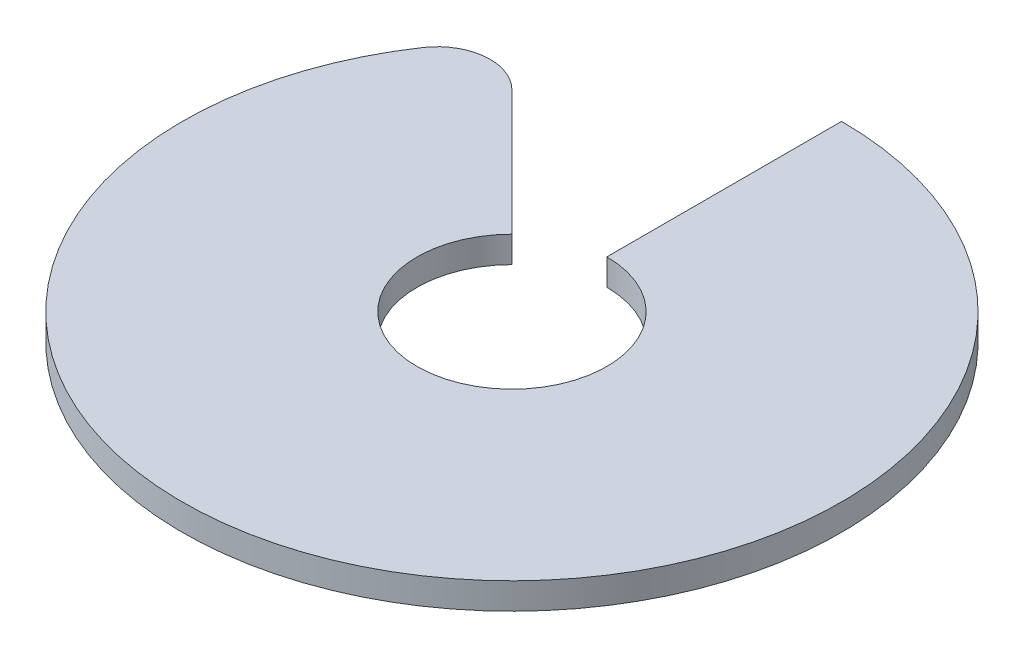
ISO-10303-21;
HEADER;
FILE_DESCRIPTION(('STEP AP214'),'2;1');
FILE_NAME('part.step','',(''),(''),'','','');
FILE_SCHEMA(('AUTOMOTIVE_DESIGN { 1 0 10303 214 1 1 1 1 }'));
ENDSEC;
DATA;
#1=APPLICATION_CONTEXT('core data for automotive mechanical design processes');
#2=APPLICATION_PROTOCOL_DEFINITION('international standard','automotive_design',2000,#1);
#3=PRODUCT_CONTEXT('',#1,'mechanical');
#4=PRODUCT('Part','Part','',(#3));
#5=PRODUCT_RELATED_PRODUCT_CATEGORY('part','',(#4));
#6=PRODUCT_DEFINITION_FORMATION('','',#4);
#7=PRODUCT_DEFINITION_CONTEXT('part definition',#1,'design');
#8=PRODUCT_DEFINITION('design','',#6,#7);
#9=PRODUCT_DEFINITION_SHAPE('','',#8);
#10=(LENGTH_UNIT() NAMED_UNIT(*) SI_UNIT(.MILLI.,.METRE.));
#11=(NAMED_UNIT(*) PLANE_ANGLE_UNIT() SI_UNIT($,.RADIAN.));
#12=(NAMED_UNIT(*) SI_UNIT($,.STERADIAN.) SOLID_ANGLE_UNIT());
#13=UNCERTAINTY_MEASURE_WITH_UNIT(LENGTH_MEASURE(1.E-05),#10,'distance_accuracy_value','');
#14=(GEOMETRIC_REPRESENTATION_CONTEXT(3) GLOBAL_UNCERTAINTY_ASSIGNED_CONTEXT((#13)) GLOBAL_UNIT_ASSIGNED_CONTEXT((#10,
#11,#12)) REPRESENTATION_CONTEXT('',''));
#15=CARTESIAN_POINT('',(0.,0.,0.));
#16=DIRECTION('',(0.,0.,1.));
#17=DIRECTION('',(1.,0.,0.));
#18=AXIS2_PLACEMENT_3D('',#15,#16,#17);
#19=CARTESIAN_POINT('',(-12.7279220613579,5.,-12.7279220613578));
#20=DIRECTION('',(-0.707106781186543,0.,0.707106781186552));
#21=DIRECTION('',(0.707106781186552,0.,0.707106781186543));
#22=AXIS2_PLACEMENT_3D('',#19,#20,#21);
#23=PLANE('',#22);
#24=DIRECTION('',(-0.707106781186551,0.,-0.707106781186543));
#25=VECTOR('',#24,1.);
#26=CARTESIAN_POINT('',(-12.7279220613579,0.,-12.7279220613578));
#27=LINE('',#26,#25);
#28=CARTESIAN_POINT('',(-12.7279220613579,0.,-12.7279220613578));
#29=VERTEX_POINT('',#28);
#30=CARTESIAN_POINT('',(-36.4434493427833,0.,-36.4434493427829));
#31=VERTEX_POINT('',#30);
#32=EDGE_CURVE('E117',#29,#31,#27,.T.);
#33=ORIENTED_EDGE('',*,*,#32,.T.);
#34=DIRECTION('',(0.,-1.,0.));
#35=VECTOR('',#34,1.);
#36=CARTESIAN_POINT('',(-36.4434493427833,5.,-36.4434493427829));
#37=LINE('',#36,#35);
#38=CARTESIAN_POINT('',(-36.4434493427833,5.,-36.4434493427829));
#39=VERTEX_POINT('',#38);
#40=EDGE_CURVE('E47',#31,#39,#37,.F.);
#41=ORIENTED_EDGE('',*,*,#40,.T.);
#42=DIRECTION('',(-0.707106781186551,0.,-0.707106781186543));
#43=VECTOR('',#42,1.);
#44=CARTESIAN_POINT('',(-12.7279220613579,5.,-12.7279220613578));
#45=LINE('',#44,#43);
#46=CARTESIAN_POINT('',(-12.7279220613579,5.,-12.7279220613578));
#47=VERTEX_POINT('',#46);
#48=EDGE_CURVE('E100',#47,#39,#45,.T.);
#49=ORIENTED_EDGE('',*,*,#48,.F.);
#50=DIRECTION('',(0.,-1.,0.));
#51=VECTOR('',#50,1.);
#52=CARTESIAN_POINT('',(-12.7279220613579,5.,-12.7279220613578));
#53=LINE('',#52,#51);
#54=EDGE_CURVE('E112',#47,#29,#53,.T.);
#55=ORIENTED_EDGE('',*,*,#54,.T.);
#56=EDGE_LOOP('',(#33,#41,#49,#55));
#57=FACE_BOUND('',#56,.T.);
#58=ADVANCED_FACE('F41',(#57),#23,.F.);
#59=CARTESIAN_POINT('',(0.,5.,0.));
#60=DIRECTION('',(0.,-1.,0.));
#61=DIRECTION('',(0.,0.,-1.));
#62=AXIS2_PLACEMENT_3D('',#59,#60,#61);
#63=CYLINDRICAL_SURFACE('',#62,62.5);
#64=CARTESIAN_POINT('',(0.,5.,0.));
#65=DIRECTION('',(0.,1.,0.));
#66=DIRECTION('',(0.,0.,1.));
#67=AXIS2_PLACEMENT_3D('',#64,#65,#66);
#68=CIRCLE('',#67,62.5);
#69=CARTESIAN_POINT('',(-51.8029966126771,5.,-34.9671208701398));
#70=VERTEX_POINT('',#69);
#71=CARTESIAN_POINT('',(0.,5.,-62.5));
#72=VERTEX_POINT('',#71);
#73=EDGE_CURVE('E86',#70,#72,#68,.T.);
#74=ORIENTED_EDGE('',*,*,#73,.F.);
#75=DIRECTION('',(0.,-1.,0.));
#76=VECTOR('',#75,1.);
#77=CARTESIAN_POINT('',(-51.8029966126771,5.,-34.9671208701398));
#78=LINE('',#77,#76);
#79=CARTESIAN_POINT('',(-51.8029966126771,0.,-34.9671208701398));
#80=VERTEX_POINT('',#79);
#81=EDGE_CURVE('E108',#70,#80,#78,.T.);
#82=ORIENTED_EDGE('',*,*,#81,.T.);
#83=CARTESIAN_POINT('',(0.,0.,0.));
#84=DIRECTION('',(0.,1.,0.));
#85=DIRECTION('',(0.,0.,1.));
#86=AXIS2_PLACEMENT_3D('',#83,#84,#85);
#87=CIRCLE('',#86,62.5);
#88=CARTESIAN_POINT('',(0.,0.,-62.5));
#89=VERTEX_POINT('',#88);
#90=EDGE_CURVE('E104',#80,#89,#87,.T.);
#91=ORIENTED_EDGE('',*,*,#90,.T.);
#92=DIRECTION('',(0.,-1.,0.));
#93=VECTOR('',#92,1.);
#94=CARTESIAN_POINT('',(0.,5.,-62.5));
#95=LINE('',#94,#93);
#96=EDGE_CURVE('E105',#72,#89,#95,.T.);
#97=ORIENTED_EDGE('',*,*,#96,.F.);
#98=EDGE_LOOP('',(#74,#82,#91,#97));
#99=FACE_BOUND('',#98,.T.);
#100=ADVANCED_FACE('F101',(#99),#63,.T.);
#101=CARTESIAN_POINT('',(0.,5.,-18.));
#102=DIRECTION('',(-1.,0.,0.));
#103=DIRECTION('',(0.,0.,1.));
#104=AXIS2_PLACEMENT_3D('',#101,#102,#103);
#105=PLANE('',#104);
#106=DIRECTION('',(0.,0.,-1.));
#107=VECTOR('',#106,1.);
#108=CARTESIAN_POINT('',(0.,0.,-18.));
#109=LINE('',#108,#107);
#110=CARTESIAN_POINT('',(0.,0.,-18.));
#111=VERTEX_POINT('',#110);
#112=EDGE_CURVE('E122',#111,#89,#109,.T.);
#113=ORIENTED_EDGE('',*,*,#112,.F.);
#114=DIRECTION('',(0.,-1.,0.));
#115=VECTOR('',#114,1.);
#116=CARTESIAN_POINT('',(0.,5.,-18.));
#117=LINE('',#116,#115);
#118=CARTESIAN_POINT('',(0.,5.,-18.));
#119=VERTEX_POINT('',#118);
#120=EDGE_CURVE('E107',#119,#111,#117,.T.);
#121=ORIENTED_EDGE('',*,*,#120,.F.);
#122=DIRECTION('',(0.,0.,-1.));
#123=VECTOR('',#122,1.);
#124=CARTESIAN_POINT('',(0.,5.,-18.));
#125=LINE('',#124,#123);
#126=EDGE_CURVE('E95',#119,#72,#125,.T.);
#127=ORIENTED_EDGE('',*,*,#126,.T.);
#128=ORIENTED_EDGE('',*,*,#96,.T.);
#129=EDGE_LOOP('',(#113,#121,#127,#128));
#130=FACE_BOUND('',#129,.T.);
#131=ADVANCED_FACE('F111',(#130),#105,.T.);
#132=CARTESIAN_POINT('',(0.,5.,0.));
#133=DIRECTION('',(0.,-1.,0.));
#134=DIRECTION('',(0.,0.,-1.));
#135=AXIS2_PLACEMENT_3D('',#132,#133,#134);
#136=CYLINDRICAL_SURFACE('',#135,18.);
#137=CARTESIAN_POINT('',(0.,0.,0.));
#138=DIRECTION('',(0.,1.,0.));
#139=DIRECTION('',(0.,0.,1.));
#140=AXIS2_PLACEMENT_3D('',#137,#138,#139);
#141=CIRCLE('',#140,18.);
#142=EDGE_CURVE('E124',#29,#111,#141,.T.);
#143=ORIENTED_EDGE('',*,*,#142,.F.);
#144=ORIENTED_EDGE('',*,*,#54,.F.);
#145=CARTESIAN_POINT('',(0.,5.,0.));
#146=DIRECTION('',(0.,1.,0.));
#147=DIRECTION('',(0.,0.,1.));
#148=AXIS2_PLACEMENT_3D('',#145,#146,#147);
#149=CIRCLE('',#148,18.);
#150=EDGE_CURVE('E115',#47,#119,#149,.T.);
#151=ORIENTED_EDGE('',*,*,#150,.T.);
#152=ORIENTED_EDGE('',*,*,#120,.T.);
#153=EDGE_LOOP('',(#143,#144,#151,#152));
#154=FACE_BOUND('',#153,.T.);
#155=ADVANCED_FACE('F131',(#154),#136,.F.);
#156=CARTESIAN_POINT('',(0.,5.,0.));
#157=DIRECTION('',(0.,1.,0.));
#158=DIRECTION('',(0.,0.,1.));
#159=AXIS2_PLACEMENT_3D('',#156,#157,#158);
#160=PLANE('',#159);
#161=ORIENTED_EDGE('',*,*,#48,.T.);
#162=CARTESIAN_POINT('',(-43.5145171546488,5.,-29.3723815309174));
#163=DIRECTION('',(0.,1.,0.));
#164=DIRECTION('',(0.,0.,1.));
#165=AXIS2_PLACEMENT_3D('',#162,#163,#164);
#166=CIRCLE('',#165,10.);
#167=EDGE_CURVE('E11',#39,#70,#166,.T.);
#168=ORIENTED_EDGE('',*,*,#167,.T.);
#169=ORIENTED_EDGE('',*,*,#73,.T.);
#170=ORIENTED_EDGE('',*,*,#126,.F.);
#171=ORIENTED_EDGE('',*,*,#150,.F.);
#172=EDGE_LOOP('',(#161,#168,#169,#170,#171));
#173=FACE_BOUND('',#172,.T.);
#174=ADVANCED_FACE('F89',(#173),#160,.T.);
#175=CARTESIAN_POINT('',(0.,0.,0.));
#176=DIRECTION('',(0.,1.,0.));
#177=DIRECTION('',(0.,0.,1.));
#178=AXIS2_PLACEMENT_3D('',#175,#176,#177);
#179=PLANE('',#178);
#180=ORIENTED_EDGE('',*,*,#90,.F.);
#181=CARTESIAN_POINT('',(-43.5145171546488,0.,-29.3723815309174));
#182=DIRECTION('',(0.,1.,0.));
#183=DIRECTION('',(0.,0.,1.));
#184=AXIS2_PLACEMENT_3D('',#181,#182,#183);
#185=CIRCLE('',#184,10.);
#186=EDGE_CURVE('E64',#80,#31,#185,.F.);
#187=ORIENTED_EDGE('',*,*,#186,.T.);
#188=ORIENTED_EDGE('',*,*,#32,.F.);
#189=ORIENTED_EDGE('',*,*,#142,.T.);
#190=ORIENTED_EDGE('',*,*,#112,.T.);
#191=EDGE_LOOP('',(#180,#187,#188,#189,#190));
#192=FACE_BOUND('',#191,.T.);
#193=ADVANCED_FACE('F128',(#192),#179,.F.);
#194=CARTESIAN_POINT('',(-43.5145171546488,5.,-29.3723815309174));
#195=DIRECTION('',(0.,-1.,0.));
#196=DIRECTION('',(0.,0.,-1.));
#197=AXIS2_PLACEMENT_3D('',#194,#195,#196);
#198=CYLINDRICAL_SURFACE('',#197,10.);
#199=ORIENTED_EDGE('',*,*,#167,.F.);
#200=ORIENTED_EDGE('',*,*,#40,.F.);
#201=ORIENTED_EDGE('',*,*,#186,.F.);
#202=ORIENTED_EDGE('',*,*,#81,.F.);
#203=EDGE_LOOP('',(#199,#200,#201,#202));
#204=FACE_BOUND('',#203,.T.);
#205=ADVANCED_FACE('F43',(#204),#198,.T.);
#206=CLOSED_SHELL('',(#58,#100,#131,#155,#174,#193,#205));
#207=MANIFOLD_SOLID_BREP('B2',#206);
#208=ADVANCED_BREP_SHAPE_REPRESENTATION('',(#18,#207),#14);
#209=SHAPE_DEFINITION_REPRESENTATION(#9,#208);
ENDSEC;
END-ISO-10303-21;
